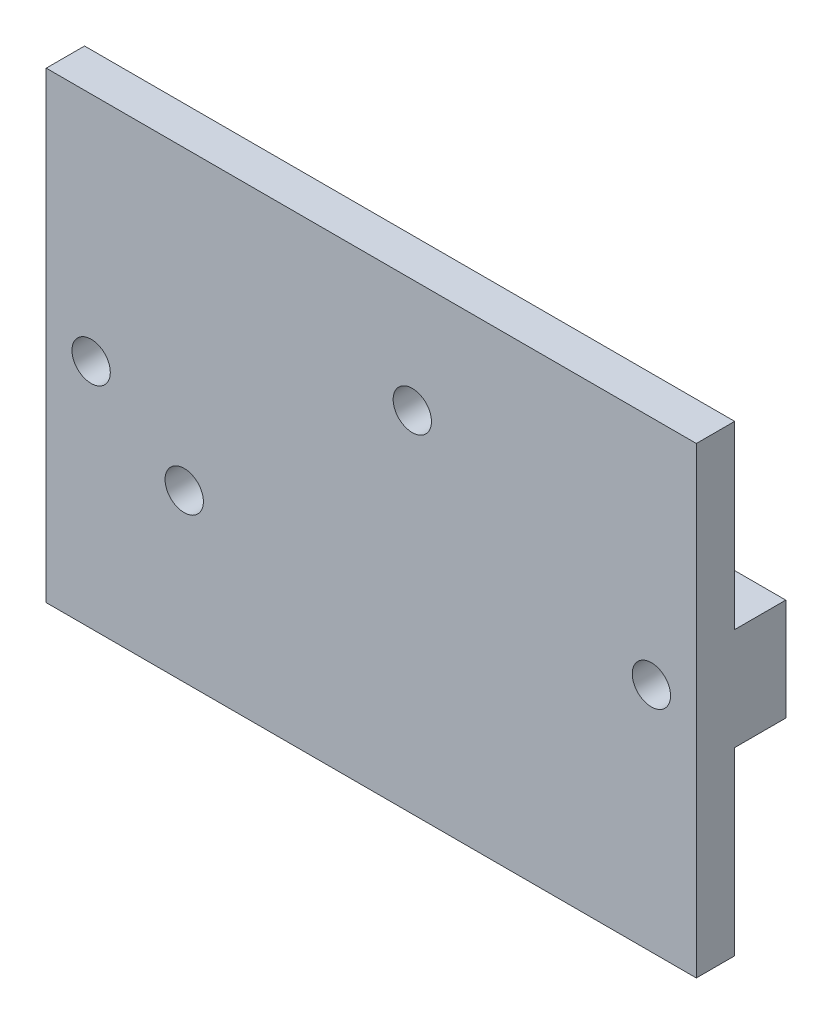
ISO-10303-21;
HEADER;
FILE_DESCRIPTION(('STEP AP214'),'2;1');
FILE_NAME('part.step','',(''),(''),'','','');
FILE_SCHEMA(('AUTOMOTIVE_DESIGN { 1 0 10303 214 1 1 1 1 }'));
ENDSEC;
DATA;
#1=APPLICATION_CONTEXT('core data for automotive mechanical design processes');
#2=APPLICATION_PROTOCOL_DEFINITION('international standard','automotive_design',2000,#1);
#3=PRODUCT_CONTEXT('',#1,'mechanical');
#4=PRODUCT('Part','Part','',(#3));
#5=PRODUCT_RELATED_PRODUCT_CATEGORY('part','',(#4));
#6=PRODUCT_DEFINITION_FORMATION('','',#4);
#7=PRODUCT_DEFINITION_CONTEXT('part definition',#1,'design');
#8=PRODUCT_DEFINITION('design','',#6,#7);
#9=PRODUCT_DEFINITION_SHAPE('','',#8);
#10=(LENGTH_UNIT() NAMED_UNIT(*) SI_UNIT(.MILLI.,.METRE.));
#11=(NAMED_UNIT(*) PLANE_ANGLE_UNIT() SI_UNIT($,.RADIAN.));
#12=(NAMED_UNIT(*) SI_UNIT($,.STERADIAN.) SOLID_ANGLE_UNIT());
#13=UNCERTAINTY_MEASURE_WITH_UNIT(LENGTH_MEASURE(1.E-05),#10,'distance_accuracy_value','');
#14=(GEOMETRIC_REPRESENTATION_CONTEXT(3) GLOBAL_UNCERTAINTY_ASSIGNED_CONTEXT((#13)) GLOBAL_UNIT_ASSIGNED_CONTEXT((#10,
#11,#12)) REPRESENTATION_CONTEXT('',''));
#15=CARTESIAN_POINT('',(0.,0.,0.));
#16=DIRECTION('',(0.,0.,1.));
#17=DIRECTION('',(1.,0.,0.));
#18=AXIS2_PLACEMENT_3D('',#15,#16,#17);
#19=CARTESIAN_POINT('',(0.,0.,0.));
#20=DIRECTION('',(0.,0.,1.));
#21=DIRECTION('',(1.,0.,0.));
#22=AXIS2_PLACEMENT_3D('',#19,#20,#21);
#23=PLANE('',#22);
#24=CARTESIAN_POINT('',(43.85,0.,0.));
#25=DIRECTION('',(0.,0.,1.));
#26=DIRECTION('',(1.,0.,0.));
#27=AXIS2_PLACEMENT_3D('',#24,#25,#26);
#28=CIRCLE('',#27,1.5);
#29=CARTESIAN_POINT('',(45.35,0.,0.));
#30=VERTEX_POINT('',#29);
#31=EDGE_CURVE('E195',#30,#30,#28,.T.);
#32=ORIENTED_EDGE('',*,*,#31,.T.);
#33=EDGE_LOOP('',(#32));
#34=FACE_BOUND('',#33,.T.);
#35=CARTESIAN_POINT('',(43.85,0.,0.));
#36=DIRECTION('',(0.,0.,-1.));
#37=DIRECTION('',(-1.,0.,0.));
#38=AXIS2_PLACEMENT_3D('',#35,#36,#37);
#39=CIRCLE('',#38,2.5);
#40=CARTESIAN_POINT('',(41.35,0.,0.));
#41=VERTEX_POINT('',#40);
#42=EDGE_CURVE('E342',#41,#41,#39,.T.);
#43=ORIENTED_EDGE('',*,*,#42,.T.);
#44=EDGE_LOOP('',(#43));
#45=FACE_BOUND('',#44,.T.);
#46=ADVANCED_FACE('F35',(#34,#45),#23,.F.);
#47=CARTESIAN_POINT('',(0.,0.,0.));
#48=DIRECTION('',(0.,0.,1.));
#49=DIRECTION('',(1.,0.,0.));
#50=AXIS2_PLACEMENT_3D('',#47,#48,#49);
#51=CIRCLE('',#50,1.5);
#52=CARTESIAN_POINT('',(1.5,0.,0.));
#53=VERTEX_POINT('',#52);
#54=EDGE_CURVE('E201',#53,#53,#51,.T.);
#55=ORIENTED_EDGE('',*,*,#54,.T.);
#56=EDGE_LOOP('',(#55));
#57=FACE_BOUND('',#56,.T.);
#58=CARTESIAN_POINT('',(0.,0.,0.));
#59=DIRECTION('',(0.,0.,-1.));
#60=DIRECTION('',(-1.,0.,0.));
#61=AXIS2_PLACEMENT_3D('',#58,#59,#60);
#62=CIRCLE('',#61,2.5);
#63=CARTESIAN_POINT('',(-2.5,0.,0.));
#64=VERTEX_POINT('',#63);
#65=EDGE_CURVE('E147',#64,#64,#62,.T.);
#66=ORIENTED_EDGE('',*,*,#65,.T.);
#67=EDGE_LOOP('',(#66));
#68=FACE_BOUND('',#67,.T.);
#69=ADVANCED_FACE('F272',(#57,#68),#23,.F.);
#70=CARTESIAN_POINT('',(0.,0.,3.));
#71=DIRECTION('',(0.,0.,1.));
#72=DIRECTION('',(1.,0.,0.));
#73=AXIS2_PLACEMENT_3D('',#70,#71,#72);
#74=PLANE('',#73);
#75=CARTESIAN_POINT('',(7.285,-5.11500000000001,3.));
#76=DIRECTION('',(0.,0.,1.));
#77=DIRECTION('',(1.,0.,0.));
#78=AXIS2_PLACEMENT_3D('',#75,#76,#77);
#79=CIRCLE('',#78,1.5);
#80=CARTESIAN_POINT('',(8.785,-5.11500000000001,3.));
#81=VERTEX_POINT('',#80);
#82=EDGE_CURVE('E192',#81,#81,#79,.T.);
#83=ORIENTED_EDGE('',*,*,#82,.F.);
#84=EDGE_LOOP('',(#83));
#85=FACE_BOUND('',#84,.T.);
#86=CARTESIAN_POINT('',(0.,0.,3.));
#87=DIRECTION('',(0.,0.,1.));
#88=DIRECTION('',(1.,0.,0.));
#89=AXIS2_PLACEMENT_3D('',#86,#87,#88);
#90=CIRCLE('',#89,1.5);
#91=CARTESIAN_POINT('',(1.5,0.,3.));
#92=VERTEX_POINT('',#91);
#93=EDGE_CURVE('E204',#92,#92,#90,.T.);
#94=ORIENTED_EDGE('',*,*,#93,.F.);
#95=EDGE_LOOP('',(#94));
#96=FACE_BOUND('',#95,.T.);
#97=DIRECTION('',(0.,1.,0.));
#98=VECTOR('',#97,1.);
#99=CARTESIAN_POINT('',(47.365,18.115,3.));
#100=LINE('',#99,#98);
#101=CARTESIAN_POINT('',(47.365,-18.115,3.));
#102=VERTEX_POINT('',#101);
#103=CARTESIAN_POINT('',(47.365,18.115,3.));
#104=VERTEX_POINT('',#103);
#105=EDGE_CURVE('E210',#102,#104,#100,.T.);
#106=ORIENTED_EDGE('',*,*,#105,.T.);
#107=DIRECTION('',(-1.,0.,0.));
#108=VECTOR('',#107,1.);
#109=CARTESIAN_POINT('',(-3.515,18.115,3.));
#110=LINE('',#109,#108);
#111=CARTESIAN_POINT('',(-3.515,18.115,3.));
#112=VERTEX_POINT('',#111);
#113=EDGE_CURVE('E213',#104,#112,#110,.T.);
#114=ORIENTED_EDGE('',*,*,#113,.T.);
#115=DIRECTION('',(0.,-1.,0.));
#116=VECTOR('',#115,1.);
#117=CARTESIAN_POINT('',(-3.515,18.115,3.));
#118=LINE('',#117,#116);
#119=CARTESIAN_POINT('',(-3.515,-18.115,3.));
#120=VERTEX_POINT('',#119);
#121=EDGE_CURVE('E216',#112,#120,#118,.T.);
#122=ORIENTED_EDGE('',*,*,#121,.T.);
#123=DIRECTION('',(1.,0.,0.));
#124=VECTOR('',#123,1.);
#125=CARTESIAN_POINT('',(-3.515,-18.115,3.));
#126=LINE('',#125,#124);
#127=EDGE_CURVE('E218',#120,#102,#126,.T.);
#128=ORIENTED_EDGE('',*,*,#127,.T.);
#129=EDGE_LOOP('',(#106,#114,#122,#128));
#130=FACE_BOUND('',#129,.T.);
#131=CARTESIAN_POINT('',(43.85,0.,3.));
#132=DIRECTION('',(0.,0.,1.));
#133=DIRECTION('',(1.,0.,0.));
#134=AXIS2_PLACEMENT_3D('',#131,#132,#133);
#135=CIRCLE('',#134,1.5);
#136=CARTESIAN_POINT('',(45.35,0.,3.));
#137=VERTEX_POINT('',#136);
#138=EDGE_CURVE('E198',#137,#137,#135,.T.);
#139=ORIENTED_EDGE('',*,*,#138,.F.);
#140=EDGE_LOOP('',(#139));
#141=FACE_BOUND('',#140,.T.);
#142=CARTESIAN_POINT('',(25.135,9.23499999999999,3.));
#143=DIRECTION('',(0.,0.,1.));
#144=DIRECTION('',(1.,0.,0.));
#145=AXIS2_PLACEMENT_3D('',#142,#143,#144);
#146=CIRCLE('',#145,1.5);
#147=CARTESIAN_POINT('',(26.635,9.23499999999999,3.));
#148=VERTEX_POINT('',#147);
#149=EDGE_CURVE('E186',#148,#148,#146,.T.);
#150=ORIENTED_EDGE('',*,*,#149,.F.);
#151=EDGE_LOOP('',(#150));
#152=FACE_BOUND('',#151,.T.);
#153=ADVANCED_FACE('F278',(#85,#96,#130,#141,#152),#74,.T.);
#154=DIRECTION('',(-1.,0.,0.));
#155=VECTOR('',#154,1.);
#156=CARTESIAN_POINT('',(47.365,-4.,0.));
#157=LINE('',#156,#155);
#158=CARTESIAN_POINT('',(47.365,-4.,0.));
#159=VERTEX_POINT('',#158);
#160=CARTESIAN_POINT('',(40.4073060698383,-4.,0.));
#161=VERTEX_POINT('',#160);
#162=EDGE_CURVE('E344',#159,#161,#157,.T.);
#163=ORIENTED_EDGE('',*,*,#162,.F.);
#164=DIRECTION('',(0.,1.,0.));
#165=VECTOR('',#164,1.);
#166=CARTESIAN_POINT('',(47.365,18.115,0.));
#167=LINE('',#166,#165);
#168=CARTESIAN_POINT('',(47.365,-18.115,0.));
#169=VERTEX_POINT('',#168);
#170=EDGE_CURVE('E146',#169,#159,#167,.T.);
#171=ORIENTED_EDGE('',*,*,#170,.F.);
#172=DIRECTION('',(1.,0.,0.));
#173=VECTOR('',#172,1.);
#174=CARTESIAN_POINT('',(-3.515,-18.115,0.));
#175=LINE('',#174,#173);
#176=CARTESIAN_POINT('',(-3.515,-18.115,0.));
#177=VERTEX_POINT('',#176);
#178=EDGE_CURVE('E214',#177,#169,#175,.T.);
#179=ORIENTED_EDGE('',*,*,#178,.F.);
#180=DIRECTION('',(0.,-1.,0.));
#181=VECTOR('',#180,1.);
#182=CARTESIAN_POINT('',(-3.515,18.115,0.));
#183=LINE('',#182,#181);
#184=CARTESIAN_POINT('',(-3.515,-4.,0.));
#185=VERTEX_POINT('',#184);
#186=EDGE_CURVE('E224',#185,#177,#183,.T.);
#187=ORIENTED_EDGE('',*,*,#186,.F.);
#188=DIRECTION('',(-1.,0.,0.));
#189=VECTOR('',#188,1.);
#190=CARTESIAN_POINT('',(-3.515,-4.,0.));
#191=LINE('',#190,#189);
#192=CARTESIAN_POINT('',(2.84649050855401,-4.,0.));
#193=VERTEX_POINT('',#192);
#194=EDGE_CURVE('E58',#193,#185,#191,.T.);
#195=ORIENTED_EDGE('',*,*,#194,.F.);
#196=DIRECTION('',(0.,-1.,0.));
#197=VECTOR('',#196,1.);
#198=CARTESIAN_POINT('',(2.84649050855401,-4.,0.));
#199=LINE('',#198,#197);
#200=CARTESIAN_POINT('',(2.84649050855401,4.,0.));
#201=VERTEX_POINT('',#200);
#202=EDGE_CURVE('E171',#201,#193,#199,.T.);
#203=ORIENTED_EDGE('',*,*,#202,.F.);
#204=DIRECTION('',(1.,0.,0.));
#205=VECTOR('',#204,1.);
#206=CARTESIAN_POINT('',(-3.515,4.,0.));
#207=LINE('',#206,#205);
#208=CARTESIAN_POINT('',(-3.515,4.,0.));
#209=VERTEX_POINT('',#208);
#210=EDGE_CURVE('E157',#209,#201,#207,.T.);
#211=ORIENTED_EDGE('',*,*,#210,.F.);
#212=CARTESIAN_POINT('',(-3.515,18.115,0.));
#213=VERTEX_POINT('',#212);
#214=EDGE_CURVE('E225',#213,#209,#183,.T.);
#215=ORIENTED_EDGE('',*,*,#214,.F.);
#216=DIRECTION('',(-1.,0.,0.));
#217=VECTOR('',#216,1.);
#218=CARTESIAN_POINT('',(-3.515,18.115,0.));
#219=LINE('',#218,#217);
#220=CARTESIAN_POINT('',(47.365,18.115,0.));
#221=VERTEX_POINT('',#220);
#222=EDGE_CURVE('E222',#221,#213,#219,.T.);
#223=ORIENTED_EDGE('',*,*,#222,.F.);
#224=CARTESIAN_POINT('',(47.365,4.,0.));
#225=VERTEX_POINT('',#224);
#226=EDGE_CURVE('E207',#225,#221,#167,.T.);
#227=ORIENTED_EDGE('',*,*,#226,.F.);
#228=DIRECTION('',(1.,0.,0.));
#229=VECTOR('',#228,1.);
#230=CARTESIAN_POINT('',(47.365,4.,0.));
#231=LINE('',#230,#229);
#232=CARTESIAN_POINT('',(40.4073060698383,4.,0.));
#233=VERTEX_POINT('',#232);
#234=EDGE_CURVE('E141',#233,#225,#231,.T.);
#235=ORIENTED_EDGE('',*,*,#234,.F.);
#236=DIRECTION('',(0.,1.,0.));
#237=VECTOR('',#236,1.);
#238=CARTESIAN_POINT('',(40.4073060698383,-4.,0.));
#239=LINE('',#238,#237);
#240=EDGE_CURVE('E350',#161,#233,#239,.T.);
#241=ORIENTED_EDGE('',*,*,#240,.F.);
#242=EDGE_LOOP('',(#163,#171,#179,#187,#195,#203,#211,#215,#223,#227,#235,#241));
#243=FACE_BOUND('',#242,.T.);
#244=CARTESIAN_POINT('',(7.285,-5.11500000000001,0.));
#245=DIRECTION('',(0.,0.,1.));
#246=DIRECTION('',(1.,0.,0.));
#247=AXIS2_PLACEMENT_3D('',#244,#245,#246);
#248=CIRCLE('',#247,1.5);
#249=CARTESIAN_POINT('',(8.785,-5.11500000000001,0.));
#250=VERTEX_POINT('',#249);
#251=EDGE_CURVE('E189',#250,#250,#248,.T.);
#252=ORIENTED_EDGE('',*,*,#251,.T.);
#253=EDGE_LOOP('',(#252));
#254=FACE_BOUND('',#253,.T.);
#255=CARTESIAN_POINT('',(25.135,9.23499999999999,0.));
#256=DIRECTION('',(0.,0.,1.));
#257=DIRECTION('',(1.,0.,0.));
#258=AXIS2_PLACEMENT_3D('',#255,#256,#257);
#259=CIRCLE('',#258,1.5);
#260=CARTESIAN_POINT('',(26.635,9.23499999999999,0.));
#261=VERTEX_POINT('',#260);
#262=EDGE_CURVE('E185',#261,#261,#259,.T.);
#263=ORIENTED_EDGE('',*,*,#262,.T.);
#264=EDGE_LOOP('',(#263));
#265=FACE_BOUND('',#264,.T.);
#266=ADVANCED_FACE('F242',(#243,#254,#265),#23,.F.);
#267=CARTESIAN_POINT('',(47.365,18.115,3.));
#268=DIRECTION('',(-1.,0.,0.));
#269=DIRECTION('',(0.,-1.,0.));
#270=AXIS2_PLACEMENT_3D('',#267,#268,#269);
#271=PLANE('',#270);
#272=ORIENTED_EDGE('',*,*,#170,.T.);
#273=DIRECTION('',(0.,0.,1.));
#274=VECTOR('',#273,1.);
#275=CARTESIAN_POINT('',(47.365,-4.,-4.));
#276=LINE('',#275,#274);
#277=CARTESIAN_POINT('',(47.365,-4.,-4.));
#278=VERTEX_POINT('',#277);
#279=EDGE_CURVE('E128',#278,#159,#276,.T.);
#280=ORIENTED_EDGE('',*,*,#279,.F.);
#281=DIRECTION('',(0.,-1.,0.));
#282=VECTOR('',#281,1.);
#283=CARTESIAN_POINT('',(47.365,-4.,-4.));
#284=LINE('',#283,#282);
#285=CARTESIAN_POINT('',(47.365,4.,-4.));
#286=VERTEX_POINT('',#285);
#287=EDGE_CURVE('E135',#286,#278,#284,.T.);
#288=ORIENTED_EDGE('',*,*,#287,.F.);
#289=DIRECTION('',(0.,0.,1.));
#290=VECTOR('',#289,1.);
#291=CARTESIAN_POINT('',(47.365,4.,-4.));
#292=LINE('',#291,#290);
#293=EDGE_CURVE('E50',#286,#225,#292,.T.);
#294=ORIENTED_EDGE('',*,*,#293,.T.);
#295=ORIENTED_EDGE('',*,*,#226,.T.);
#296=DIRECTION('',(0.,0.,-1.));
#297=VECTOR('',#296,1.);
#298=CARTESIAN_POINT('',(47.365,18.115,3.));
#299=LINE('',#298,#297);
#300=EDGE_CURVE('E11',#104,#221,#299,.T.);
#301=ORIENTED_EDGE('',*,*,#300,.F.);
#302=ORIENTED_EDGE('',*,*,#105,.F.);
#303=DIRECTION('',(0.,0.,-1.));
#304=VECTOR('',#303,1.);
#305=CARTESIAN_POINT('',(47.365,-18.115,3.));
#306=LINE('',#305,#304);
#307=EDGE_CURVE('E220',#102,#169,#306,.T.);
#308=ORIENTED_EDGE('',*,*,#307,.T.);
#309=EDGE_LOOP('',(#272,#280,#288,#294,#295,#301,#302,#308));
#310=FACE_BOUND('',#309,.T.);
#311=ADVANCED_FACE('F37',(#310),#271,.F.);
#312=CARTESIAN_POINT('',(-3.515,18.115,3.));
#313=DIRECTION('',(0.,-1.,0.));
#314=DIRECTION('',(0.,0.,-1.));
#315=AXIS2_PLACEMENT_3D('',#312,#313,#314);
#316=PLANE('',#315);
#317=ORIENTED_EDGE('',*,*,#222,.T.);
#318=DIRECTION('',(0.,0.,-1.));
#319=VECTOR('',#318,1.);
#320=CARTESIAN_POINT('',(-3.515,18.115,3.));
#321=LINE('',#320,#319);
#322=EDGE_CURVE('E43',#112,#213,#321,.T.);
#323=ORIENTED_EDGE('',*,*,#322,.F.);
#324=ORIENTED_EDGE('',*,*,#113,.F.);
#325=ORIENTED_EDGE('',*,*,#300,.T.);
#326=EDGE_LOOP('',(#317,#323,#324,#325));
#327=FACE_BOUND('',#326,.T.);
#328=ADVANCED_FACE('F288',(#327),#316,.F.);
#329=CARTESIAN_POINT('',(-3.515,18.115,3.));
#330=DIRECTION('',(1.,0.,0.));
#331=DIRECTION('',(0.,1.,0.));
#332=AXIS2_PLACEMENT_3D('',#329,#330,#331);
#333=PLANE('',#332);
#334=ORIENTED_EDGE('',*,*,#214,.T.);
#335=DIRECTION('',(0.,0.,1.));
#336=VECTOR('',#335,1.);
#337=CARTESIAN_POINT('',(-3.515,4.,-4.));
#338=LINE('',#337,#336);
#339=CARTESIAN_POINT('',(-3.515,4.,-4.));
#340=VERTEX_POINT('',#339);
#341=EDGE_CURVE('E182',#340,#209,#338,.T.);
#342=ORIENTED_EDGE('',*,*,#341,.F.);
#343=DIRECTION('',(0.,1.,0.));
#344=VECTOR('',#343,1.);
#345=CARTESIAN_POINT('',(-3.515,-4.,-4.));
#346=LINE('',#345,#344);
#347=CARTESIAN_POINT('',(-3.515,-4.,-4.));
#348=VERTEX_POINT('',#347);
#349=EDGE_CURVE('E159',#348,#340,#346,.T.);
#350=ORIENTED_EDGE('',*,*,#349,.F.);
#351=DIRECTION('',(0.,0.,1.));
#352=VECTOR('',#351,1.);
#353=CARTESIAN_POINT('',(-3.515,-4.,-4.));
#354=LINE('',#353,#352);
#355=EDGE_CURVE('E168',#348,#185,#354,.T.);
#356=ORIENTED_EDGE('',*,*,#355,.T.);
#357=ORIENTED_EDGE('',*,*,#186,.T.);
#358=DIRECTION('',(0.,0.,-1.));
#359=VECTOR('',#358,1.);
#360=CARTESIAN_POINT('',(-3.515,-18.115,3.));
#361=LINE('',#360,#359);
#362=EDGE_CURVE('E230',#120,#177,#361,.T.);
#363=ORIENTED_EDGE('',*,*,#362,.F.);
#364=ORIENTED_EDGE('',*,*,#121,.F.);
#365=ORIENTED_EDGE('',*,*,#322,.T.);
#366=EDGE_LOOP('',(#334,#342,#350,#356,#357,#363,#364,#365));
#367=FACE_BOUND('',#366,.T.);
#368=ADVANCED_FACE('F237',(#367),#333,.F.);
#369=CARTESIAN_POINT('',(-3.515,-18.115,3.));
#370=DIRECTION('',(0.,1.,0.));
#371=DIRECTION('',(0.,0.,1.));
#372=AXIS2_PLACEMENT_3D('',#369,#370,#371);
#373=PLANE('',#372);
#374=ORIENTED_EDGE('',*,*,#178,.T.);
#375=ORIENTED_EDGE('',*,*,#307,.F.);
#376=ORIENTED_EDGE('',*,*,#127,.F.);
#377=ORIENTED_EDGE('',*,*,#362,.T.);
#378=EDGE_LOOP('',(#374,#375,#376,#377));
#379=FACE_BOUND('',#378,.T.);
#380=ADVANCED_FACE('F299',(#379),#373,.F.);
#381=CARTESIAN_POINT('',(0.,0.,3.));
#382=DIRECTION('',(0.,0.,-1.));
#383=DIRECTION('',(-1.,0.,0.));
#384=AXIS2_PLACEMENT_3D('',#381,#382,#383);
#385=CYLINDRICAL_SURFACE('',#384,1.5);
#386=ORIENTED_EDGE('',*,*,#93,.T.);
#387=EDGE_LOOP('',(#386));
#388=FACE_BOUND('',#387,.T.);
#389=ORIENTED_EDGE('',*,*,#54,.F.);
#390=EDGE_LOOP('',(#389));
#391=FACE_BOUND('',#390,.T.);
#392=ADVANCED_FACE('F295',(#388,#391),#385,.F.);
#393=CARTESIAN_POINT('',(43.85,0.,3.));
#394=DIRECTION('',(0.,0.,-1.));
#395=DIRECTION('',(-1.,0.,0.));
#396=AXIS2_PLACEMENT_3D('',#393,#394,#395);
#397=CYLINDRICAL_SURFACE('',#396,1.5);
#398=ORIENTED_EDGE('',*,*,#138,.T.);
#399=EDGE_LOOP('',(#398));
#400=FACE_BOUND('',#399,.T.);
#401=ORIENTED_EDGE('',*,*,#31,.F.);
#402=EDGE_LOOP('',(#401));
#403=FACE_BOUND('',#402,.T.);
#404=ADVANCED_FACE('F298',(#400,#403),#397,.F.);
#405=CARTESIAN_POINT('',(7.285,-5.11500000000001,3.));
#406=DIRECTION('',(0.,0.,-1.));
#407=DIRECTION('',(-1.,0.,0.));
#408=AXIS2_PLACEMENT_3D('',#405,#406,#407);
#409=CYLINDRICAL_SURFACE('',#408,1.5);
#410=ORIENTED_EDGE('',*,*,#82,.T.);
#411=EDGE_LOOP('',(#410));
#412=FACE_BOUND('',#411,.T.);
#413=ORIENTED_EDGE('',*,*,#251,.F.);
#414=EDGE_LOOP('',(#413));
#415=FACE_BOUND('',#414,.T.);
#416=ADVANCED_FACE('F303',(#412,#415),#409,.F.);
#417=CARTESIAN_POINT('',(25.135,9.23499999999999,3.));
#418=DIRECTION('',(0.,0.,-1.));
#419=DIRECTION('',(-1.,0.,0.));
#420=AXIS2_PLACEMENT_3D('',#417,#418,#419);
#421=CYLINDRICAL_SURFACE('',#420,1.5);
#422=ORIENTED_EDGE('',*,*,#149,.T.);
#423=EDGE_LOOP('',(#422));
#424=FACE_BOUND('',#423,.T.);
#425=ORIENTED_EDGE('',*,*,#262,.F.);
#426=EDGE_LOOP('',(#425));
#427=FACE_BOUND('',#426,.T.);
#428=ADVANCED_FACE('F307',(#424,#427),#421,.F.);
#429=CARTESIAN_POINT('',(0.,0.,-4.));
#430=DIRECTION('',(0.,0.,-1.));
#431=DIRECTION('',(-1.,0.,0.));
#432=AXIS2_PLACEMENT_3D('',#429,#430,#431);
#433=PLANE('',#432);
#434=ORIENTED_EDGE('',*,*,#349,.T.);
#435=DIRECTION('',(1.,0.,0.));
#436=VECTOR('',#435,1.);
#437=CARTESIAN_POINT('',(-3.515,4.,-4.));
#438=LINE('',#437,#436);
#439=CARTESIAN_POINT('',(2.84649050855401,4.,-4.));
#440=VERTEX_POINT('',#439);
#441=EDGE_CURVE('E162',#340,#440,#438,.T.);
#442=ORIENTED_EDGE('',*,*,#441,.T.);
#443=DIRECTION('',(0.,-1.,0.));
#444=VECTOR('',#443,1.);
#445=CARTESIAN_POINT('',(2.84649050855401,-4.,-4.));
#446=LINE('',#445,#444);
#447=CARTESIAN_POINT('',(2.84649050855401,-4.,-4.));
#448=VERTEX_POINT('',#447);
#449=EDGE_CURVE('E164',#440,#448,#446,.T.);
#450=ORIENTED_EDGE('',*,*,#449,.T.);
#451=DIRECTION('',(-1.,0.,0.));
#452=VECTOR('',#451,1.);
#453=CARTESIAN_POINT('',(-3.515,-4.,-4.));
#454=LINE('',#453,#452);
#455=EDGE_CURVE('E166',#448,#348,#454,.T.);
#456=ORIENTED_EDGE('',*,*,#455,.T.);
#457=EDGE_LOOP('',(#434,#442,#450,#456));
#458=FACE_BOUND('',#457,.T.);
#459=CARTESIAN_POINT('',(0.,0.,-4.));
#460=DIRECTION('',(0.,0.,-1.));
#461=DIRECTION('',(-1.,0.,0.));
#462=AXIS2_PLACEMENT_3D('',#459,#460,#461);
#463=CIRCLE('',#462,2.5);
#464=CARTESIAN_POINT('',(-2.5,0.,-4.));
#465=VERTEX_POINT('',#464);
#466=EDGE_CURVE('E150',#465,#465,#463,.T.);
#467=ORIENTED_EDGE('',*,*,#466,.F.);
#468=EDGE_LOOP('',(#467));
#469=FACE_BOUND('',#468,.T.);
#470=ADVANCED_FACE('F254',(#458,#469),#433,.T.);
#471=CARTESIAN_POINT('',(-3.515,4.,-4.));
#472=DIRECTION('',(0.,-1.,0.));
#473=DIRECTION('',(0.,0.,-1.));
#474=AXIS2_PLACEMENT_3D('',#471,#472,#473);
#475=PLANE('',#474);
#476=ORIENTED_EDGE('',*,*,#210,.T.);
#477=DIRECTION('',(0.,0.,1.));
#478=VECTOR('',#477,1.);
#479=CARTESIAN_POINT('',(2.84649050855401,4.,-4.));
#480=LINE('',#479,#478);
#481=EDGE_CURVE('E179',#440,#201,#480,.T.);
#482=ORIENTED_EDGE('',*,*,#481,.F.);
#483=ORIENTED_EDGE('',*,*,#441,.F.);
#484=ORIENTED_EDGE('',*,*,#341,.T.);
#485=EDGE_LOOP('',(#476,#482,#483,#484));
#486=FACE_BOUND('',#485,.T.);
#487=ADVANCED_FACE('F247',(#486),#475,.F.);
#488=CARTESIAN_POINT('',(2.84649050855401,-4.,-4.));
#489=DIRECTION('',(-1.,0.,0.));
#490=DIRECTION('',(0.,0.,1.));
#491=AXIS2_PLACEMENT_3D('',#488,#489,#490);
#492=PLANE('',#491);
#493=ORIENTED_EDGE('',*,*,#202,.T.);
#494=DIRECTION('',(0.,0.,1.));
#495=VECTOR('',#494,1.);
#496=CARTESIAN_POINT('',(2.84649050855401,-4.,-4.));
#497=LINE('',#496,#495);
#498=EDGE_CURVE('E176',#448,#193,#497,.T.);
#499=ORIENTED_EDGE('',*,*,#498,.F.);
#500=ORIENTED_EDGE('',*,*,#449,.F.);
#501=ORIENTED_EDGE('',*,*,#481,.T.);
#502=EDGE_LOOP('',(#493,#499,#500,#501));
#503=FACE_BOUND('',#502,.T.);
#504=ADVANCED_FACE('F250',(#503),#492,.F.);
#505=CARTESIAN_POINT('',(-3.515,-4.,-4.));
#506=DIRECTION('',(0.,1.,0.));
#507=DIRECTION('',(-1.,0.,0.));
#508=AXIS2_PLACEMENT_3D('',#505,#506,#507);
#509=PLANE('',#508);
#510=ORIENTED_EDGE('',*,*,#194,.T.);
#511=ORIENTED_EDGE('',*,*,#355,.F.);
#512=ORIENTED_EDGE('',*,*,#455,.F.);
#513=ORIENTED_EDGE('',*,*,#498,.T.);
#514=EDGE_LOOP('',(#510,#511,#512,#513));
#515=FACE_BOUND('',#514,.T.);
#516=ADVANCED_FACE('F259',(#515),#509,.F.);
#517=CARTESIAN_POINT('',(0.,0.,-4.));
#518=DIRECTION('',(0.,0.,1.));
#519=DIRECTION('',(1.,0.,0.));
#520=AXIS2_PLACEMENT_3D('',#517,#518,#519);
#521=CYLINDRICAL_SURFACE('',#520,2.5);
#522=ORIENTED_EDGE('',*,*,#466,.T.);
#523=EDGE_LOOP('',(#522));
#524=FACE_BOUND('',#523,.T.);
#525=ORIENTED_EDGE('',*,*,#65,.F.);
#526=EDGE_LOOP('',(#525));
#527=FACE_BOUND('',#526,.T.);
#528=ADVANCED_FACE('F261',(#524,#527),#521,.F.);
#529=CARTESIAN_POINT('',(0.,0.,-4.));
#530=DIRECTION('',(0.,0.,1.));
#531=DIRECTION('',(1.,0.,0.));
#532=AXIS2_PLACEMENT_3D('',#529,#530,#531);
#533=PLANE('',#532);
#534=ORIENTED_EDGE('',*,*,#287,.T.);
#535=DIRECTION('',(-1.,0.,0.));
#536=VECTOR('',#535,1.);
#537=CARTESIAN_POINT('',(47.365,-4.,-4.));
#538=LINE('',#537,#536);
#539=CARTESIAN_POINT('',(40.4073060698383,-4.,-4.));
#540=VERTEX_POINT('',#539);
#541=EDGE_CURVE('E124',#278,#540,#538,.T.);
#542=ORIENTED_EDGE('',*,*,#541,.T.);
#543=DIRECTION('',(0.,1.,0.));
#544=VECTOR('',#543,1.);
#545=CARTESIAN_POINT('',(40.4073060698383,-4.,-4.));
#546=LINE('',#545,#544);
#547=CARTESIAN_POINT('',(40.4073060698383,4.,-4.));
#548=VERTEX_POINT('',#547);
#549=EDGE_CURVE('E134',#540,#548,#546,.T.);
#550=ORIENTED_EDGE('',*,*,#549,.T.);
#551=DIRECTION('',(1.,0.,0.));
#552=VECTOR('',#551,1.);
#553=CARTESIAN_POINT('',(47.365,4.,-4.));
#554=LINE('',#553,#552);
#555=EDGE_CURVE('E140',#548,#286,#554,.T.);
#556=ORIENTED_EDGE('',*,*,#555,.T.);
#557=EDGE_LOOP('',(#534,#542,#550,#556));
#558=FACE_BOUND('',#557,.T.);
#559=CARTESIAN_POINT('',(43.85,0.,-4.));
#560=DIRECTION('',(0.,0.,-1.));
#561=DIRECTION('',(-1.,0.,0.));
#562=AXIS2_PLACEMENT_3D('',#559,#560,#561);
#563=CIRCLE('',#562,2.5);
#564=CARTESIAN_POINT('',(41.35,0.,-4.));
#565=VERTEX_POINT('',#564);
#566=EDGE_CURVE('E339',#565,#565,#563,.T.);
#567=ORIENTED_EDGE('',*,*,#566,.F.);
#568=EDGE_LOOP('',(#567));
#569=FACE_BOUND('',#568,.T.);
#570=ADVANCED_FACE('F137',(#558,#569),#533,.F.);
#571=CARTESIAN_POINT('',(47.365,-4.,-4.));
#572=DIRECTION('',(0.,1.,0.));
#573=DIRECTION('',(0.,0.,1.));
#574=AXIS2_PLACEMENT_3D('',#571,#572,#573);
#575=PLANE('',#574);
#576=ORIENTED_EDGE('',*,*,#162,.T.);
#577=DIRECTION('',(0.,0.,1.));
#578=VECTOR('',#577,1.);
#579=CARTESIAN_POINT('',(40.4073060698383,-4.,-4.));
#580=LINE('',#579,#578);
#581=EDGE_CURVE('E131',#540,#161,#580,.T.);
#582=ORIENTED_EDGE('',*,*,#581,.F.);
#583=ORIENTED_EDGE('',*,*,#541,.F.);
#584=ORIENTED_EDGE('',*,*,#279,.T.);
#585=EDGE_LOOP('',(#576,#582,#583,#584));
#586=FACE_BOUND('',#585,.T.);
#587=ADVANCED_FACE('F126',(#586),#575,.F.);
#588=CARTESIAN_POINT('',(40.4073060698383,-4.,-4.));
#589=DIRECTION('',(1.,0.,0.));
#590=DIRECTION('',(0.,0.,-1.));
#591=AXIS2_PLACEMENT_3D('',#588,#589,#590);
#592=PLANE('',#591);
#593=ORIENTED_EDGE('',*,*,#240,.T.);
#594=DIRECTION('',(0.,0.,1.));
#595=VECTOR('',#594,1.);
#596=CARTESIAN_POINT('',(40.4073060698383,4.,-4.));
#597=LINE('',#596,#595);
#598=EDGE_CURVE('E152',#548,#233,#597,.T.);
#599=ORIENTED_EDGE('',*,*,#598,.F.);
#600=ORIENTED_EDGE('',*,*,#549,.F.);
#601=ORIENTED_EDGE('',*,*,#581,.T.);
#602=EDGE_LOOP('',(#593,#599,#600,#601));
#603=FACE_BOUND('',#602,.T.);
#604=ADVANCED_FACE('F321',(#603),#592,.F.);
#605=CARTESIAN_POINT('',(47.365,4.,-4.));
#606=DIRECTION('',(0.,-1.,0.));
#607=DIRECTION('',(0.,0.,-1.));
#608=AXIS2_PLACEMENT_3D('',#605,#606,#607);
#609=PLANE('',#608);
#610=ORIENTED_EDGE('',*,*,#234,.T.);
#611=ORIENTED_EDGE('',*,*,#293,.F.);
#612=ORIENTED_EDGE('',*,*,#555,.F.);
#613=ORIENTED_EDGE('',*,*,#598,.T.);
#614=EDGE_LOOP('',(#610,#611,#612,#613));
#615=FACE_BOUND('',#614,.T.);
#616=ADVANCED_FACE('F324',(#615),#609,.F.);
#617=CARTESIAN_POINT('',(43.85,0.,-4.));
#618=DIRECTION('',(0.,0.,1.));
#619=DIRECTION('',(1.,0.,0.));
#620=AXIS2_PLACEMENT_3D('',#617,#618,#619);
#621=CYLINDRICAL_SURFACE('',#620,2.5);
#622=ORIENTED_EDGE('',*,*,#566,.T.);
#623=EDGE_LOOP('',(#622));
#624=FACE_BOUND('',#623,.T.);
#625=ORIENTED_EDGE('',*,*,#42,.F.);
#626=EDGE_LOOP('',(#625));
#627=FACE_BOUND('',#626,.T.);
#628=ADVANCED_FACE('F328',(#624,#627),#621,.F.);
#629=CLOSED_SHELL('',(#46,#69,#153,#266,#311,#328,#368,#380,#392,#404,#416,#428,#470,#487,#504,
#516,#528,#570,#587,#604,#616,#628));
#630=MANIFOLD_SOLID_BREP('B2',#629);
#631=ADVANCED_BREP_SHAPE_REPRESENTATION('',(#18,#630),#14);
#632=SHAPE_DEFINITION_REPRESENTATION(#9,#631);
ENDSEC;
END-ISO-10303-21;
